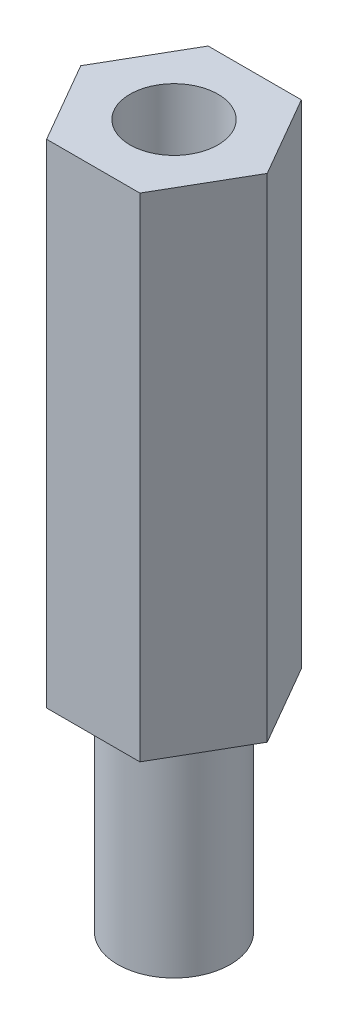
ISO-10303-21;
HEADER;
FILE_DESCRIPTION(('STEP AP214'),'2;1');
FILE_NAME('part.step','',(''),(''),'','','');
FILE_SCHEMA(('AUTOMOTIVE_DESIGN { 1 0 10303 214 1 1 1 1 }'));
ENDSEC;
DATA;
#1=APPLICATION_CONTEXT('core data for automotive mechanical design processes');
#2=APPLICATION_PROTOCOL_DEFINITION('international standard','automotive_design',2000,#1);
#3=PRODUCT_CONTEXT('',#1,'mechanical');
#4=PRODUCT('Part','Part','',(#3));
#5=PRODUCT_RELATED_PRODUCT_CATEGORY('part','',(#4));
#6=PRODUCT_DEFINITION_FORMATION('','',#4);
#7=PRODUCT_DEFINITION_CONTEXT('part definition',#1,'design');
#8=PRODUCT_DEFINITION('design','',#6,#7);
#9=PRODUCT_DEFINITION_SHAPE('','',#8);
#10=(LENGTH_UNIT() NAMED_UNIT(*) SI_UNIT(.MILLI.,.METRE.));
#11=(NAMED_UNIT(*) PLANE_ANGLE_UNIT() SI_UNIT($,.RADIAN.));
#12=(NAMED_UNIT(*) SI_UNIT($,.STERADIAN.) SOLID_ANGLE_UNIT());
#13=UNCERTAINTY_MEASURE_WITH_UNIT(LENGTH_MEASURE(1.E-05),#10,'distance_accuracy_value','');
#14=(GEOMETRIC_REPRESENTATION_CONTEXT(3) GLOBAL_UNCERTAINTY_ASSIGNED_CONTEXT((#13)) GLOBAL_UNIT_ASSIGNED_CONTEXT((#10,
#11,#12)) REPRESENTATION_CONTEXT('',''));
#15=CARTESIAN_POINT('',(0.,0.,0.));
#16=DIRECTION('',(0.,0.,1.));
#17=DIRECTION('',(1.,0.,0.));
#18=AXIS2_PLACEMENT_3D('',#15,#16,#17);
#19=CARTESIAN_POINT('',(-1.325,14.,2.29496732002876));
#20=DIRECTION('',(0.,0.,-1.));
#21=DIRECTION('',(-1.,0.,0.));
#22=AXIS2_PLACEMENT_3D('',#19,#20,#21);
#23=PLANE('',#22);
#24=DIRECTION('',(1.,0.,0.));
#25=VECTOR('',#24,1.);
#26=CARTESIAN_POINT('',(-1.325,0.,2.29496732002876));
#27=LINE('',#26,#25);
#28=CARTESIAN_POINT('',(-1.325,0.,2.29496732002876));
#29=VERTEX_POINT('',#28);
#30=CARTESIAN_POINT('',(1.325,0.,2.29496732002876));
#31=VERTEX_POINT('',#30);
#32=EDGE_CURVE('E122',#29,#31,#27,.T.);
#33=ORIENTED_EDGE('',*,*,#32,.T.);
#34=DIRECTION('',(0.,-1.,0.));
#35=VECTOR('',#34,1.);
#36=CARTESIAN_POINT('',(1.325,14.,2.29496732002876));
#37=LINE('',#36,#35);
#38=CARTESIAN_POINT('',(1.325,14.,2.29496732002876));
#39=VERTEX_POINT('',#38);
#40=EDGE_CURVE('E45',#39,#31,#37,.T.);
#41=ORIENTED_EDGE('',*,*,#40,.F.);
#42=DIRECTION('',(1.,0.,0.));
#43=VECTOR('',#42,1.);
#44=CARTESIAN_POINT('',(-1.325,14.,2.29496732002876));
#45=LINE('',#44,#43);
#46=CARTESIAN_POINT('',(-1.325,14.,2.29496732002876));
#47=VERTEX_POINT('',#46);
#48=EDGE_CURVE('E133',#47,#39,#45,.T.);
#49=ORIENTED_EDGE('',*,*,#48,.F.);
#50=DIRECTION('',(0.,-1.,0.));
#51=VECTOR('',#50,1.);
#52=CARTESIAN_POINT('',(-1.325,14.,2.29496732002876));
#53=LINE('',#52,#51);
#54=EDGE_CURVE('E118',#47,#29,#53,.T.);
#55=ORIENTED_EDGE('',*,*,#54,.T.);
#56=EDGE_LOOP('',(#33,#41,#49,#55));
#57=FACE_BOUND('',#56,.T.);
#58=ADVANCED_FACE('F37',(#57),#23,.F.);
#59=CARTESIAN_POINT('',(1.325,14.,2.29496732002876));
#60=DIRECTION('',(-0.866025403784439,0.,-0.5));
#61=DIRECTION('',(-0.5,0.,0.866025403784439));
#62=AXIS2_PLACEMENT_3D('',#59,#60,#61);
#63=PLANE('',#62);
#64=DIRECTION('',(0.5,0.,-0.866025403784439));
#65=VECTOR('',#64,1.);
#66=CARTESIAN_POINT('',(1.325,0.,2.29496732002876));
#67=LINE('',#66,#65);
#68=CARTESIAN_POINT('',(2.65,0.,0.));
#69=VERTEX_POINT('',#68);
#70=EDGE_CURVE('E125',#31,#69,#67,.T.);
#71=ORIENTED_EDGE('',*,*,#70,.T.);
#72=DIRECTION('',(0.,-1.,0.));
#73=VECTOR('',#72,1.);
#74=CARTESIAN_POINT('',(2.65,14.,0.));
#75=LINE('',#74,#73);
#76=CARTESIAN_POINT('',(2.65,14.,0.));
#77=VERTEX_POINT('',#76);
#78=EDGE_CURVE('E137',#77,#69,#75,.T.);
#79=ORIENTED_EDGE('',*,*,#78,.F.);
#80=DIRECTION('',(0.5,0.,-0.866025403784439));
#81=VECTOR('',#80,1.);
#82=CARTESIAN_POINT('',(1.325,14.,2.29496732002876));
#83=LINE('',#82,#81);
#84=EDGE_CURVE('E91',#39,#77,#83,.T.);
#85=ORIENTED_EDGE('',*,*,#84,.F.);
#86=ORIENTED_EDGE('',*,*,#40,.T.);
#87=EDGE_LOOP('',(#71,#79,#85,#86));
#88=FACE_BOUND('',#87,.T.);
#89=ADVANCED_FACE('F140',(#88),#63,.F.);
#90=CARTESIAN_POINT('',(2.65,14.,0.));
#91=DIRECTION('',(-0.866025403784438,0.,0.5));
#92=DIRECTION('',(0.5,0.,0.866025403784439));
#93=AXIS2_PLACEMENT_3D('',#90,#91,#92);
#94=PLANE('',#93);
#95=DIRECTION('',(-0.5,0.,-0.866025403784439));
#96=VECTOR('',#95,1.);
#97=CARTESIAN_POINT('',(2.65,0.,0.));
#98=LINE('',#97,#96);
#99=CARTESIAN_POINT('',(1.325,0.,-2.29496732002876));
#100=VERTEX_POINT('',#99);
#101=EDGE_CURVE('E128',#69,#100,#98,.T.);
#102=ORIENTED_EDGE('',*,*,#101,.T.);
#103=DIRECTION('',(0.,-1.,0.));
#104=VECTOR('',#103,1.);
#105=CARTESIAN_POINT('',(1.325,14.,-2.29496732002876));
#106=LINE('',#105,#104);
#107=CARTESIAN_POINT('',(1.325,14.,-2.29496732002876));
#108=VERTEX_POINT('',#107);
#109=EDGE_CURVE('E113',#108,#100,#106,.T.);
#110=ORIENTED_EDGE('',*,*,#109,.F.);
#111=DIRECTION('',(-0.5,0.,-0.866025403784439));
#112=VECTOR('',#111,1.);
#113=CARTESIAN_POINT('',(2.65,14.,0.));
#114=LINE('',#113,#112);
#115=EDGE_CURVE('E104',#77,#108,#114,.T.);
#116=ORIENTED_EDGE('',*,*,#115,.F.);
#117=ORIENTED_EDGE('',*,*,#78,.T.);
#118=EDGE_LOOP('',(#102,#110,#116,#117));
#119=FACE_BOUND('',#118,.T.);
#120=ADVANCED_FACE('F148',(#119),#94,.F.);
#121=CARTESIAN_POINT('',(1.325,14.,-2.29496732002876));
#122=DIRECTION('',(0.,0.,1.));
#123=DIRECTION('',(1.,0.,0.));
#124=AXIS2_PLACEMENT_3D('',#121,#122,#123);
#125=PLANE('',#124);
#126=DIRECTION('',(-1.,0.,0.));
#127=VECTOR('',#126,1.);
#128=CARTESIAN_POINT('',(1.325,0.,-2.29496732002876));
#129=LINE('',#128,#127);
#130=CARTESIAN_POINT('',(-1.325,0.,-2.29496732002876));
#131=VERTEX_POINT('',#130);
#132=EDGE_CURVE('E112',#100,#131,#129,.T.);
#133=ORIENTED_EDGE('',*,*,#132,.T.);
#134=DIRECTION('',(0.,-1.,0.));
#135=VECTOR('',#134,1.);
#136=CARTESIAN_POINT('',(-1.325,14.,-2.29496732002876));
#137=LINE('',#136,#135);
#138=CARTESIAN_POINT('',(-1.325,14.,-2.29496732002876));
#139=VERTEX_POINT('',#138);
#140=EDGE_CURVE('E109',#139,#131,#137,.T.);
#141=ORIENTED_EDGE('',*,*,#140,.F.);
#142=DIRECTION('',(-1.,0.,0.));
#143=VECTOR('',#142,1.);
#144=CARTESIAN_POINT('',(1.325,14.,-2.29496732002876));
#145=LINE('',#144,#143);
#146=EDGE_CURVE('E98',#108,#139,#145,.T.);
#147=ORIENTED_EDGE('',*,*,#146,.F.);
#148=ORIENTED_EDGE('',*,*,#109,.T.);
#149=EDGE_LOOP('',(#133,#141,#147,#148));
#150=FACE_BOUND('',#149,.T.);
#151=ADVANCED_FACE('F110',(#150),#125,.F.);
#152=CARTESIAN_POINT('',(-1.325,14.,-2.29496732002876));
#153=DIRECTION('',(0.866025403784439,0.,0.5));
#154=DIRECTION('',(0.5,0.,-0.866025403784439));
#155=AXIS2_PLACEMENT_3D('',#152,#153,#154);
#156=PLANE('',#155);
#157=DIRECTION('',(-0.5,0.,0.866025403784439));
#158=VECTOR('',#157,1.);
#159=CARTESIAN_POINT('',(-1.325,0.,-2.29496732002876));
#160=LINE('',#159,#158);
#161=CARTESIAN_POINT('',(-2.65,0.,0.));
#162=VERTEX_POINT('',#161);
#163=EDGE_CURVE('E76',#131,#162,#160,.T.);
#164=ORIENTED_EDGE('',*,*,#163,.T.);
#165=DIRECTION('',(0.,-1.,0.));
#166=VECTOR('',#165,1.);
#167=CARTESIAN_POINT('',(-2.65,14.,0.));
#168=LINE('',#167,#166);
#169=CARTESIAN_POINT('',(-2.65,14.,0.));
#170=VERTEX_POINT('',#169);
#171=EDGE_CURVE('E114',#170,#162,#168,.T.);
#172=ORIENTED_EDGE('',*,*,#171,.F.);
#173=DIRECTION('',(-0.5,0.,0.866025403784439));
#174=VECTOR('',#173,1.);
#175=CARTESIAN_POINT('',(-1.325,14.,-2.29496732002876));
#176=LINE('',#175,#174);
#177=EDGE_CURVE('E102',#139,#170,#176,.T.);
#178=ORIENTED_EDGE('',*,*,#177,.F.);
#179=ORIENTED_EDGE('',*,*,#140,.T.);
#180=EDGE_LOOP('',(#164,#172,#178,#179));
#181=FACE_BOUND('',#180,.T.);
#182=ADVANCED_FACE('F116',(#181),#156,.F.);
#183=CARTESIAN_POINT('',(-2.65,14.,0.));
#184=DIRECTION('',(0.866025403784438,0.,-0.5));
#185=DIRECTION('',(-0.5,0.,-0.866025403784439));
#186=AXIS2_PLACEMENT_3D('',#183,#184,#185);
#187=PLANE('',#186);
#188=DIRECTION('',(0.5,0.,0.866025403784439));
#189=VECTOR('',#188,1.);
#190=CARTESIAN_POINT('',(-2.65,0.,0.));
#191=LINE('',#190,#189);
#192=EDGE_CURVE('E82',#162,#29,#191,.T.);
#193=ORIENTED_EDGE('',*,*,#192,.T.);
#194=ORIENTED_EDGE('',*,*,#54,.F.);
#195=DIRECTION('',(0.5,0.,0.866025403784439));
#196=VECTOR('',#195,1.);
#197=CARTESIAN_POINT('',(-2.65,14.,0.));
#198=LINE('',#197,#196);
#199=EDGE_CURVE('E53',#170,#47,#198,.T.);
#200=ORIENTED_EDGE('',*,*,#199,.F.);
#201=ORIENTED_EDGE('',*,*,#171,.T.);
#202=EDGE_LOOP('',(#193,#194,#200,#201));
#203=FACE_BOUND('',#202,.T.);
#204=ADVANCED_FACE('F171',(#203),#187,.F.);
#205=CARTESIAN_POINT('',(0.,14.,0.));
#206=DIRECTION('',(0.,1.,0.));
#207=DIRECTION('',(0.,0.,1.));
#208=AXIS2_PLACEMENT_3D('',#205,#206,#207);
#209=PLANE('',#208);
#210=CARTESIAN_POINT('',(0.,14.,0.));
#211=DIRECTION('',(0.,1.,0.));
#212=DIRECTION('',(0.,0.,1.));
#213=AXIS2_PLACEMENT_3D('',#210,#211,#212);
#214=CIRCLE('',#213,1.25);
#215=CARTESIAN_POINT('',(0.,14.,1.25));
#216=VERTEX_POINT('',#215);
#217=EDGE_CURVE('E155',#216,#216,#214,.T.);
#218=ORIENTED_EDGE('',*,*,#217,.F.);
#219=EDGE_LOOP('',(#218));
#220=FACE_BOUND('',#219,.T.);
#221=ORIENTED_EDGE('',*,*,#48,.T.);
#222=ORIENTED_EDGE('',*,*,#84,.T.);
#223=ORIENTED_EDGE('',*,*,#115,.T.);
#224=ORIENTED_EDGE('',*,*,#146,.T.);
#225=ORIENTED_EDGE('',*,*,#177,.T.);
#226=ORIENTED_EDGE('',*,*,#199,.T.);
#227=EDGE_LOOP('',(#221,#222,#223,#224,#225,#226));
#228=FACE_BOUND('',#227,.T.);
#229=ADVANCED_FACE('F100',(#220,#228),#209,.T.);
#230=CARTESIAN_POINT('',(0.,0.,0.));
#231=DIRECTION('',(0.,1.,0.));
#232=DIRECTION('',(0.,0.,1.));
#233=AXIS2_PLACEMENT_3D('',#230,#231,#232);
#234=PLANE('',#233);
#235=CARTESIAN_POINT('',(0.,0.,0.));
#236=DIRECTION('',(0.,1.,0.));
#237=DIRECTION('',(0.,0.,1.));
#238=AXIS2_PLACEMENT_3D('',#235,#236,#237);
#239=CIRCLE('',#238,1.6);
#240=CARTESIAN_POINT('',(0.,0.,1.6));
#241=VERTEX_POINT('',#240);
#242=EDGE_CURVE('E11',#241,#241,#239,.F.);
#243=ORIENTED_EDGE('',*,*,#242,.F.);
#244=EDGE_LOOP('',(#243));
#245=FACE_BOUND('',#244,.T.);
#246=ORIENTED_EDGE('',*,*,#32,.F.);
#247=ORIENTED_EDGE('',*,*,#192,.F.);
#248=ORIENTED_EDGE('',*,*,#163,.F.);
#249=ORIENTED_EDGE('',*,*,#132,.F.);
#250=ORIENTED_EDGE('',*,*,#101,.F.);
#251=ORIENTED_EDGE('',*,*,#70,.F.);
#252=EDGE_LOOP('',(#246,#247,#248,#249,#250,#251));
#253=FACE_BOUND('',#252,.T.);
#254=ADVANCED_FACE('F145',(#245,#253),#234,.F.);
#255=CARTESIAN_POINT('',(0.,-6.,0.));
#256=DIRECTION('',(0.,1.,0.));
#257=DIRECTION('',(0.,0.,1.));
#258=AXIS2_PLACEMENT_3D('',#255,#256,#257);
#259=CYLINDRICAL_SURFACE('',#258,1.6);
#260=CARTESIAN_POINT('',(0.,-6.,0.));
#261=DIRECTION('',(0.,-1.,0.));
#262=DIRECTION('',(0.,0.,-1.));
#263=AXIS2_PLACEMENT_3D('',#260,#261,#262);
#264=CIRCLE('',#263,1.6);
#265=CARTESIAN_POINT('',(0.,-6.,-1.6));
#266=VERTEX_POINT('',#265);
#267=EDGE_CURVE('E126',#266,#266,#264,.T.);
#268=ORIENTED_EDGE('',*,*,#267,.F.);
#269=EDGE_LOOP('',(#268));
#270=FACE_BOUND('',#269,.T.);
#271=ORIENTED_EDGE('',*,*,#242,.T.);
#272=EDGE_LOOP('',(#271));
#273=FACE_BOUND('',#272,.T.);
#274=ADVANCED_FACE('F177',(#270,#273),#259,.T.);
#275=CARTESIAN_POINT('',(0.,-6.,0.));
#276=DIRECTION('',(0.,-1.,0.));
#277=DIRECTION('',(0.,0.,-1.));
#278=AXIS2_PLACEMENT_3D('',#275,#276,#277);
#279=PLANE('',#278);
#280=ORIENTED_EDGE('',*,*,#267,.T.);
#281=EDGE_LOOP('',(#280));
#282=FACE_BOUND('',#281,.T.);
#283=ADVANCED_FACE('F166',(#282),#279,.T.);
#284=CARTESIAN_POINT('',(0.,9.,0.));
#285=DIRECTION('',(0.,1.,0.));
#286=DIRECTION('',(0.,0.,1.));
#287=AXIS2_PLACEMENT_3D('',#284,#285,#286);
#288=CYLINDRICAL_SURFACE('',#287,1.25);
#289=CARTESIAN_POINT('',(0.,9.,0.));
#290=DIRECTION('',(0.,1.,0.));
#291=DIRECTION('',(0.,0.,1.));
#292=AXIS2_PLACEMENT_3D('',#289,#290,#291);
#293=CIRCLE('',#292,1.25);
#294=CARTESIAN_POINT('',(0.,9.,1.25));
#295=VERTEX_POINT('',#294);
#296=EDGE_CURVE('E154',#295,#295,#293,.T.);
#297=ORIENTED_EDGE('',*,*,#296,.F.);
#298=EDGE_LOOP('',(#297));
#299=FACE_BOUND('',#298,.T.);
#300=ORIENTED_EDGE('',*,*,#217,.T.);
#301=EDGE_LOOP('',(#300));
#302=FACE_BOUND('',#301,.T.);
#303=ADVANCED_FACE('F163',(#299,#302),#288,.F.);
#304=CARTESIAN_POINT('',(0.,9.,0.));
#305=DIRECTION('',(0.,1.,0.));
#306=DIRECTION('',(0.,0.,1.));
#307=AXIS2_PLACEMENT_3D('',#304,#305,#306);
#308=PLANE('',#307);
#309=ORIENTED_EDGE('',*,*,#296,.T.);
#310=EDGE_LOOP('',(#309));
#311=FACE_BOUND('',#310,.T.);
#312=ADVANCED_FACE('F161',(#311),#308,.T.);
#313=CLOSED_SHELL('',(#58,#89,#120,#151,#182,#204,#229,#254,#274,#283,#303,#312));
#314=MANIFOLD_SOLID_BREP('B2',#313);
#315=ADVANCED_BREP_SHAPE_REPRESENTATION('',(#18,#314),#14);
#316=SHAPE_DEFINITION_REPRESENTATION(#9,#315);
ENDSEC;
END-ISO-10303-21;
